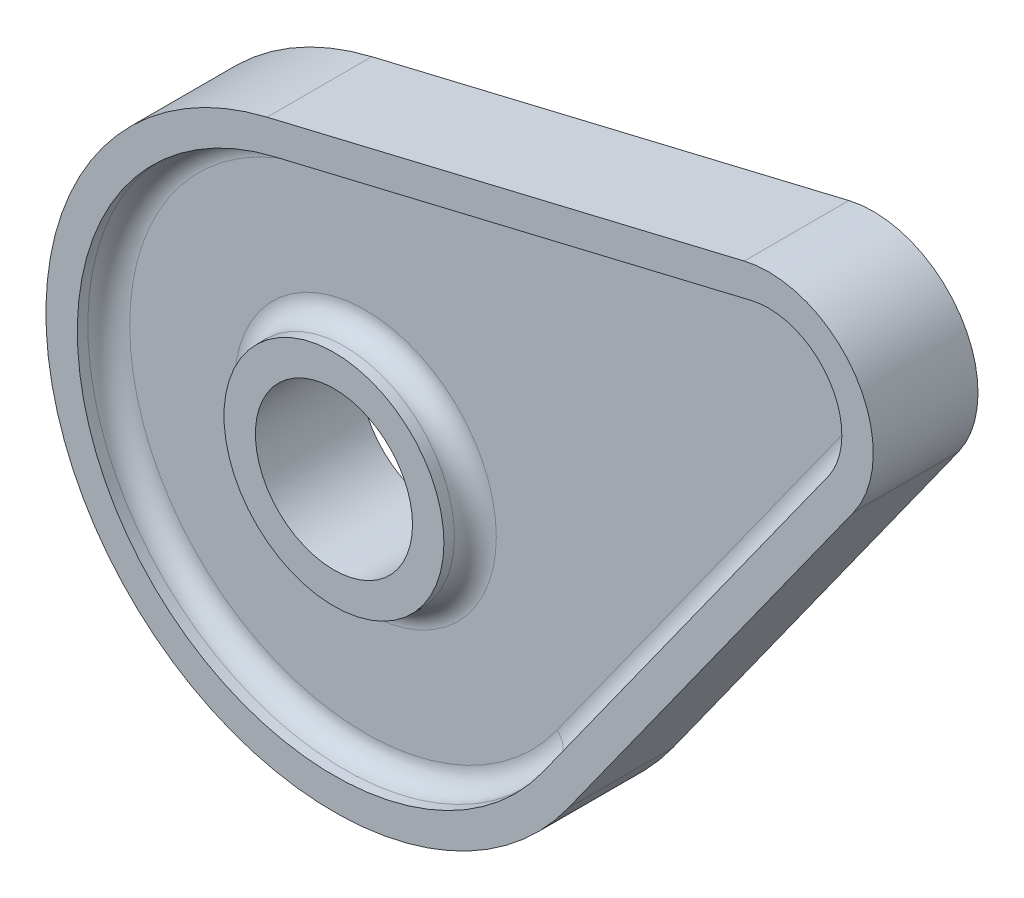
ISO-10303-21;
HEADER;
FILE_DESCRIPTION(('STEP AP214'),'2;1');
FILE_NAME('part.step','',(''),(''),'','','');
FILE_SCHEMA(('AUTOMOTIVE_DESIGN { 1 0 10303 214 1 1 1 1 }'));
ENDSEC;
DATA;
#1=APPLICATION_CONTEXT('core data for automotive mechanical design processes');
#2=APPLICATION_PROTOCOL_DEFINITION('international standard','automotive_design',2000,#1);
#3=PRODUCT_CONTEXT('',#1,'mechanical');
#4=PRODUCT('Part','Part','',(#3));
#5=PRODUCT_RELATED_PRODUCT_CATEGORY('part','',(#4));
#6=PRODUCT_DEFINITION_FORMATION('','',#4);
#7=PRODUCT_DEFINITION_CONTEXT('part definition',#1,'design');
#8=PRODUCT_DEFINITION('design','',#6,#7);
#9=PRODUCT_DEFINITION_SHAPE('','',#8);
#10=(LENGTH_UNIT() NAMED_UNIT(*) SI_UNIT(.MILLI.,.METRE.));
#11=(NAMED_UNIT(*) PLANE_ANGLE_UNIT() SI_UNIT($,.RADIAN.));
#12=(NAMED_UNIT(*) SI_UNIT($,.STERADIAN.) SOLID_ANGLE_UNIT());
#13=UNCERTAINTY_MEASURE_WITH_UNIT(LENGTH_MEASURE(1.E-05),#10,'distance_accuracy_value','');
#14=(GEOMETRIC_REPRESENTATION_CONTEXT(3) GLOBAL_UNCERTAINTY_ASSIGNED_CONTEXT((#13)) GLOBAL_UNIT_ASSIGNED_CONTEXT((#10,
#11,#12)) REPRESENTATION_CONTEXT('',''));
#15=CARTESIAN_POINT('',(0.,0.,0.));
#16=DIRECTION('',(0.,0.,1.));
#17=DIRECTION('',(1.,0.,0.));
#18=AXIS2_PLACEMENT_3D('',#15,#16,#17);
#19=CARTESIAN_POINT('',(-18.5097038965459,27.9026043452524,13.));
#20=DIRECTION('',(0.,0.,1.));
#21=DIRECTION('',(1.,0.,0.));
#22=AXIS2_PLACEMENT_3D('',#19,#20,#21);
#23=PLANE('',#22);
#24=CARTESIAN_POINT('',(-60.,0.,13.));
#25=DIRECTION('',(0.,0.,1.));
#26=DIRECTION('',(1.,0.,0.));
#27=AXIS2_PLACEMENT_3D('',#24,#25,#26);
#28=CIRCLE('',#27,7.5);
#29=CARTESIAN_POINT('',(-52.5,0.,13.));
#30=VERTEX_POINT('',#29);
#31=EDGE_CURVE('E214',#30,#30,#28,.T.);
#32=ORIENTED_EDGE('',*,*,#31,.T.);
#33=EDGE_LOOP('',(#32));
#34=FACE_BOUND('',#33,.T.);
#35=CARTESIAN_POINT('',(-60.0000000000032,0.,13.));
#36=DIRECTION('',(0.,0.,-1.));
#37=DIRECTION('',(-1.,0.,0.));
#38=AXIS2_PLACEMENT_3D('',#35,#36,#37);
#39=CIRCLE('',#38,10.4999999999969);
#40=CARTESIAN_POINT('',(-70.5000000000002,0.,13.));
#41=VERTEX_POINT('',#40);
#42=EDGE_CURVE('E307',#41,#41,#39,.T.);
#43=ORIENTED_EDGE('',*,*,#42,.T.);
#44=EDGE_LOOP('',(#43));
#45=FACE_BOUND('',#44,.T.);
#46=ADVANCED_FACE('F53',(#34,#45),#23,.F.);
#47=CARTESIAN_POINT('',(-18.5097038965459,27.9026043452524,23.));
#48=DIRECTION('',(0.,0.,1.));
#49=DIRECTION('',(1.,0.,0.));
#50=AXIS2_PLACEMENT_3D('',#47,#48,#49);
#51=PLANE('',#50);
#52=CARTESIAN_POINT('',(-60.,0.,23.));
#53=DIRECTION('',(0.,0.,1.));
#54=DIRECTION('',(1.,0.,0.));
#55=AXIS2_PLACEMENT_3D('',#52,#53,#54);
#56=CIRCLE('',#55,7.5);
#57=CARTESIAN_POINT('',(-52.5,0.,23.));
#58=VERTEX_POINT('',#57);
#59=EDGE_CURVE('E220',#58,#58,#56,.T.);
#60=ORIENTED_EDGE('',*,*,#59,.F.);
#61=EDGE_LOOP('',(#60));
#62=FACE_BOUND('',#61,.T.);
#63=CARTESIAN_POINT('',(-60.0000000000032,0.,23.));
#64=DIRECTION('',(0.,0.,1.));
#65=DIRECTION('',(1.,0.,0.));
#66=AXIS2_PLACEMENT_3D('',#63,#64,#65);
#67=CIRCLE('',#66,10.5000000000032);
#68=CARTESIAN_POINT('',(-49.5,0.,23.));
#69=VERTEX_POINT('',#68);
#70=EDGE_CURVE('E194',#69,#69,#67,.T.);
#71=ORIENTED_EDGE('',*,*,#70,.T.);
#72=EDGE_LOOP('',(#71));
#73=FACE_BOUND('',#72,.T.);
#74=ADVANCED_FACE('F358',(#62,#73),#51,.T.);
#75=DIRECTION('',(-0.972638678773851,-0.232323052134432,0.));
#76=VECTOR('',#75,1.);
#77=CARTESIAN_POINT('',(-8.93035481047707,37.3876308185639,23.));
#78=LINE('',#77,#76);
#79=CARTESIAN_POINT('',(-20.1359652614869,34.7110750966694,23.));
#80=VERTEX_POINT('',#79);
#81=CARTESIAN_POINT('',(-65.691914777294,23.8296476299609,23.));
#82=VERTEX_POINT('',#81);
#83=EDGE_CURVE('E199',#80,#82,#78,.T.);
#84=ORIENTED_EDGE('',*,*,#83,.F.);
#85=CARTESIAN_POINT('',(-18.5097038965459,27.9026043452524,23.));
#86=DIRECTION('',(0.,0.,1.));
#87=DIRECTION('',(1.,0.,0.));
#88=AXIS2_PLACEMENT_3D('',#85,#86,#87);
#89=CIRCLE('',#88,6.99999999999999);
#90=CARTESIAN_POINT('',(-12.8173935134663,23.8285888196702,23.));
#91=VERTEX_POINT('',#90);
#92=EDGE_CURVE('E208',#91,#80,#89,.T.);
#93=ORIENTED_EDGE('',*,*,#92,.F.);
#94=DIRECTION('',(0.582002217940317,0.81318719758279,0.));
#95=VECTOR('',#94,1.);
#96=CARTESIAN_POINT('',(-19.7533187579747,14.1375508160935,23.));
#97=LINE('',#96,#95);
#98=CARTESIAN_POINT('',(-40.0769136592217,-14.2590543395378,23.));
#99=VERTEX_POINT('',#98);
#100=EDGE_CURVE('E205',#99,#91,#97,.T.);
#101=ORIENTED_EDGE('',*,*,#100,.F.);
#102=CARTESIAN_POINT('',(-60.0000000000032,0.,23.));
#103=DIRECTION('',(0.,0.,1.));
#104=DIRECTION('',(1.,0.,0.));
#105=AXIS2_PLACEMENT_3D('',#102,#103,#104);
#106=CIRCLE('',#105,24.500000000001);
#107=EDGE_CURVE('E202',#82,#99,#106,.T.);
#108=ORIENTED_EDGE('',*,*,#107,.F.);
#109=EDGE_LOOP('',(#84,#93,#101,#108));
#110=FACE_BOUND('',#109,.T.);
#111=CARTESIAN_POINT('',(-18.5097038965459,27.9026043452524,23.));
#112=DIRECTION('',(0.,0.,1.));
#113=DIRECTION('',(1.,0.,0.));
#114=AXIS2_PLACEMENT_3D('',#111,#112,#113);
#115=CIRCLE('',#114,9.99999999999999);
#116=CARTESIAN_POINT('',(-10.377831920718,22.0825821658492,23.));
#117=VERTEX_POINT('',#116);
#118=CARTESIAN_POINT('',(-20.8329344178902,37.6289911329909,23.));
#119=VERTEX_POINT('',#118);
#120=EDGE_CURVE('E226',#117,#119,#115,.T.);
#121=ORIENTED_EDGE('',*,*,#120,.T.);
#122=DIRECTION('',(-0.972638678773851,-0.232323052134432,0.));
#123=VECTOR('',#122,1.);
#124=CARTESIAN_POINT('',(-20.8329344178902,37.6289911329909,23.));
#125=LINE('',#124,#123);
#126=CARTESIAN_POINT('',(-66.3888839336969,26.7475636662809,23.));
#127=VERTEX_POINT('',#126);
#128=EDGE_CURVE('E229',#119,#127,#125,.T.);
#129=ORIENTED_EDGE('',*,*,#128,.T.);
#130=CARTESIAN_POINT('',(-60.,0.,23.));
#131=DIRECTION('',(0.,0.,1.));
#132=DIRECTION('',(1.,0.,0.));
#133=AXIS2_PLACEMENT_3D('',#130,#131,#132);
#134=CIRCLE('',#133,27.5);
#135=CARTESIAN_POINT('',(-37.6373520664733,-16.0050609933587,23.));
#136=VERTEX_POINT('',#135);
#137=EDGE_CURVE('E232',#127,#136,#134,.T.);
#138=ORIENTED_EDGE('',*,*,#137,.T.);
#139=DIRECTION('',(0.582002217940317,0.81318719758279,0.));
#140=VECTOR('',#139,1.);
#141=CARTESIAN_POINT('',(-37.6373520664733,-16.0050609933587,23.));
#142=LINE('',#141,#140);
#143=EDGE_CURVE('E234',#136,#117,#142,.T.);
#144=ORIENTED_EDGE('',*,*,#143,.T.);
#145=EDGE_LOOP('',(#121,#129,#138,#144));
#146=FACE_BOUND('',#145,.T.);
#147=ADVANCED_FACE('F364',(#110,#146),#51,.T.);
#148=DIRECTION('',(-0.582002217940345,-0.81318719758277,0.));
#149=VECTOR('',#148,1.);
#150=CARTESIAN_POINT('',(-12.8173935134663,23.8285888196702,13.));
#151=LINE('',#150,#149);
#152=CARTESIAN_POINT('',(-12.8173935134663,23.8285888196702,13.));
#153=VERTEX_POINT('',#152);
#154=CARTESIAN_POINT('',(-40.0769136592236,-14.2590543395364,13.));
#155=VERTEX_POINT('',#154);
#156=EDGE_CURVE('E177',#153,#155,#151,.T.);
#157=ORIENTED_EDGE('',*,*,#156,.F.);
#158=CARTESIAN_POINT('',(-18.5097038965459,27.9026043452524,13.));
#159=DIRECTION('',(0.,0.,-1.));
#160=DIRECTION('',(-1.,0.,0.));
#161=AXIS2_PLACEMENT_3D('',#158,#159,#160);
#162=CIRCLE('',#161,7.);
#163=CARTESIAN_POINT('',(-20.1359652614869,34.7110750966694,13.));
#164=VERTEX_POINT('',#163);
#165=EDGE_CURVE('E182',#164,#153,#162,.T.);
#166=ORIENTED_EDGE('',*,*,#165,.F.);
#167=DIRECTION('',(0.972638678773851,0.232323052134432,0.));
#168=VECTOR('',#167,1.);
#169=CARTESIAN_POINT('',(-65.6919147772936,23.8296476299593,13.));
#170=LINE('',#169,#168);
#171=CARTESIAN_POINT('',(-65.6919147772936,23.8296476299593,13.));
#172=VERTEX_POINT('',#171);
#173=EDGE_CURVE('E187',#172,#164,#170,.T.);
#174=ORIENTED_EDGE('',*,*,#173,.F.);
#175=CARTESIAN_POINT('',(-60.0000000000032,0.,13.));
#176=DIRECTION('',(0.,0.,-1.));
#177=DIRECTION('',(-1.,0.,0.));
#178=AXIS2_PLACEMENT_3D('',#175,#176,#177);
#179=CIRCLE('',#178,24.5000000000002);
#180=EDGE_CURVE('E171',#155,#172,#179,.T.);
#181=ORIENTED_EDGE('',*,*,#180,.F.);
#182=EDGE_LOOP('',(#157,#166,#174,#181));
#183=FACE_BOUND('',#182,.T.);
#184=CARTESIAN_POINT('',(-18.5097038965459,27.9026043452524,13.));
#185=DIRECTION('',(0.,0.,1.));
#186=DIRECTION('',(1.,0.,0.));
#187=AXIS2_PLACEMENT_3D('',#184,#185,#186);
#188=CIRCLE('',#187,9.99999999999999);
#189=CARTESIAN_POINT('',(-10.377831920718,22.0825821658492,13.));
#190=VERTEX_POINT('',#189);
#191=CARTESIAN_POINT('',(-20.8329344178902,37.6289911329909,13.));
#192=VERTEX_POINT('',#191);
#193=EDGE_CURVE('E223',#190,#192,#188,.T.);
#194=ORIENTED_EDGE('',*,*,#193,.F.);
#195=DIRECTION('',(0.582002217940317,0.81318719758279,0.));
#196=VECTOR('',#195,1.);
#197=CARTESIAN_POINT('',(-37.6373520664733,-16.0050609933587,13.));
#198=LINE('',#197,#196);
#199=CARTESIAN_POINT('',(-37.6373520664733,-16.0050609933587,13.));
#200=VERTEX_POINT('',#199);
#201=EDGE_CURVE('E230',#200,#190,#198,.T.);
#202=ORIENTED_EDGE('',*,*,#201,.F.);
#203=CARTESIAN_POINT('',(-60.,0.,13.));
#204=DIRECTION('',(0.,0.,1.));
#205=DIRECTION('',(1.,0.,0.));
#206=AXIS2_PLACEMENT_3D('',#203,#204,#205);
#207=CIRCLE('',#206,27.5);
#208=CARTESIAN_POINT('',(-66.3888839336969,26.7475636662809,13.));
#209=VERTEX_POINT('',#208);
#210=EDGE_CURVE('E241',#209,#200,#207,.T.);
#211=ORIENTED_EDGE('',*,*,#210,.F.);
#212=DIRECTION('',(-0.972638678773851,-0.232323052134432,0.));
#213=VECTOR('',#212,1.);
#214=CARTESIAN_POINT('',(-20.8329344178902,37.6289911329909,13.));
#215=LINE('',#214,#213);
#216=EDGE_CURVE('E239',#192,#209,#215,.T.);
#217=ORIENTED_EDGE('',*,*,#216,.F.);
#218=EDGE_LOOP('',(#194,#202,#211,#217));
#219=FACE_BOUND('',#218,.T.);
#220=ADVANCED_FACE('F184',(#183,#219),#23,.F.);
#221=CARTESIAN_POINT('',(-18.5097038965459,27.9026043452524,23.));
#222=DIRECTION('',(0.,0.,-1.));
#223=DIRECTION('',(-1.,0.,0.));
#224=AXIS2_PLACEMENT_3D('',#221,#222,#223);
#225=CYLINDRICAL_SURFACE('',#224,9.99999999999999);
#226=ORIENTED_EDGE('',*,*,#193,.T.);
#227=DIRECTION('',(0.,0.,-1.));
#228=VECTOR('',#227,1.);
#229=CARTESIAN_POINT('',(-20.8329344178902,37.6289911329909,23.));
#230=LINE('',#229,#228);
#231=EDGE_CURVE('E252',#119,#192,#230,.T.);
#232=ORIENTED_EDGE('',*,*,#231,.F.);
#233=ORIENTED_EDGE('',*,*,#120,.F.);
#234=DIRECTION('',(0.,0.,-1.));
#235=VECTOR('',#234,1.);
#236=CARTESIAN_POINT('',(-10.377831920718,22.0825821658492,23.));
#237=LINE('',#236,#235);
#238=EDGE_CURVE('E236',#117,#190,#237,.T.);
#239=ORIENTED_EDGE('',*,*,#238,.T.);
#240=EDGE_LOOP('',(#226,#232,#233,#239));
#241=FACE_BOUND('',#240,.T.);
#242=ADVANCED_FACE('F369',(#241),#225,.T.);
#243=CARTESIAN_POINT('',(-20.8329344178902,37.6289911329909,23.));
#244=DIRECTION('',(0.232323052134432,-0.972638678773851,0.));
#245=DIRECTION('',(0.972638678773851,0.232323052134432,0.));
#246=AXIS2_PLACEMENT_3D('',#243,#244,#245);
#247=PLANE('',#246);
#248=ORIENTED_EDGE('',*,*,#216,.T.);
#249=DIRECTION('',(0.,0.,-1.));
#250=VECTOR('',#249,1.);
#251=CARTESIAN_POINT('',(-66.3888839336969,26.7475636662809,23.));
#252=LINE('',#251,#250);
#253=EDGE_CURVE('E249',#127,#209,#252,.T.);
#254=ORIENTED_EDGE('',*,*,#253,.F.);
#255=ORIENTED_EDGE('',*,*,#128,.F.);
#256=ORIENTED_EDGE('',*,*,#231,.T.);
#257=EDGE_LOOP('',(#248,#254,#255,#256));
#258=FACE_BOUND('',#257,.T.);
#259=ADVANCED_FACE('F374',(#258),#247,.F.);
#260=CARTESIAN_POINT('',(-60.,0.,23.));
#261=DIRECTION('',(0.,0.,-1.));
#262=DIRECTION('',(-1.,0.,0.));
#263=AXIS2_PLACEMENT_3D('',#260,#261,#262);
#264=CYLINDRICAL_SURFACE('',#263,27.5);
#265=ORIENTED_EDGE('',*,*,#210,.T.);
#266=DIRECTION('',(0.,0.,-1.));
#267=VECTOR('',#266,1.);
#268=CARTESIAN_POINT('',(-37.6373520664733,-16.0050609933587,23.));
#269=LINE('',#268,#267);
#270=EDGE_CURVE('E246',#136,#200,#269,.T.);
#271=ORIENTED_EDGE('',*,*,#270,.F.);
#272=ORIENTED_EDGE('',*,*,#137,.F.);
#273=ORIENTED_EDGE('',*,*,#253,.T.);
#274=EDGE_LOOP('',(#265,#271,#272,#273));
#275=FACE_BOUND('',#274,.T.);
#276=ADVANCED_FACE('F593',(#275),#264,.T.);
#277=CARTESIAN_POINT('',(-37.6373520664733,-16.0050609933587,23.));
#278=DIRECTION('',(-0.81318719758279,0.582002217940317,0.));
#279=DIRECTION('',(-0.582002217940317,-0.81318719758279,0.));
#280=AXIS2_PLACEMENT_3D('',#277,#278,#279);
#281=PLANE('',#280);
#282=ORIENTED_EDGE('',*,*,#201,.T.);
#283=ORIENTED_EDGE('',*,*,#238,.F.);
#284=ORIENTED_EDGE('',*,*,#143,.F.);
#285=ORIENTED_EDGE('',*,*,#270,.T.);
#286=EDGE_LOOP('',(#282,#283,#284,#285));
#287=FACE_BOUND('',#286,.T.);
#288=ADVANCED_FACE('F387',(#287),#281,.F.);
#289=CARTESIAN_POINT('',(-60.,0.,23.));
#290=DIRECTION('',(0.,0.,-1.));
#291=DIRECTION('',(-1.,0.,0.));
#292=AXIS2_PLACEMENT_3D('',#289,#290,#291);
#293=CYLINDRICAL_SURFACE('',#292,7.5);
#294=ORIENTED_EDGE('',*,*,#59,.T.);
#295=EDGE_LOOP('',(#294));
#296=FACE_BOUND('',#295,.T.);
#297=ORIENTED_EDGE('',*,*,#31,.F.);
#298=EDGE_LOOP('',(#297));
#299=FACE_BOUND('',#298,.T.);
#300=ADVANCED_FACE('F383',(#296,#299),#293,.F.);
#301=CARTESIAN_POINT('',(-8.93035481047707,37.3876308185639,20.));
#302=DIRECTION('',(-0.232323052134432,0.972638678773851,0.));
#303=DIRECTION('',(-0.972638678773851,-0.232323052134432,0.));
#304=AXIS2_PLACEMENT_3D('',#301,#302,#303);
#305=PLANE('',#304);
#306=DIRECTION('',(0.,0.,1.));
#307=VECTOR('',#306,1.);
#308=CARTESIAN_POINT('',(-65.6919147772936,23.8296476299593,20.));
#309=LINE('',#308,#307);
#310=CARTESIAN_POINT('',(-65.6919147772936,23.8296476299593,22.));
#311=VERTEX_POINT('',#310);
#312=EDGE_CURVE('E211',#311,#82,#309,.T.);
#313=ORIENTED_EDGE('',*,*,#312,.F.);
#314=DIRECTION('',(-0.972638678773851,-0.232323052134432,0.));
#315=VECTOR('',#314,1.);
#316=CARTESIAN_POINT('',(-8.93035481047707,37.3876308185639,22.));
#317=LINE('',#316,#315);
#318=CARTESIAN_POINT('',(-20.1359652614869,34.7110750966694,22.));
#319=VERTEX_POINT('',#318);
#320=EDGE_CURVE('E274',#311,#319,#317,.F.);
#321=ORIENTED_EDGE('',*,*,#320,.T.);
#322=DIRECTION('',(0.,0.,1.));
#323=VECTOR('',#322,1.);
#324=CARTESIAN_POINT('',(-20.1359652614869,34.7110750966694,20.));
#325=LINE('',#324,#323);
#326=EDGE_CURVE('E212',#319,#80,#325,.T.);
#327=ORIENTED_EDGE('',*,*,#326,.T.);
#328=ORIENTED_EDGE('',*,*,#83,.T.);
#329=EDGE_LOOP('',(#313,#321,#327,#328));
#330=FACE_BOUND('',#329,.T.);
#331=ADVANCED_FACE('F386',(#330),#305,.F.);
#332=CARTESIAN_POINT('',(-18.5097038965459,27.9026043452524,20.));
#333=DIRECTION('',(0.,0.,1.));
#334=DIRECTION('',(1.,0.,0.));
#335=AXIS2_PLACEMENT_3D('',#332,#333,#334);
#336=CYLINDRICAL_SURFACE('',#335,6.99999999999999);
#337=ORIENTED_EDGE('',*,*,#326,.F.);
#338=CARTESIAN_POINT('',(-18.5097038965459,27.9026043452524,22.));
#339=DIRECTION('',(0.,0.,1.));
#340=DIRECTION('',(1.,0.,0.));
#341=AXIS2_PLACEMENT_3D('',#338,#339,#340);
#342=CIRCLE('',#341,6.99999999999999);
#343=CARTESIAN_POINT('',(-12.8173935134663,23.8285888196702,22.));
#344=VERTEX_POINT('',#343);
#345=EDGE_CURVE('E267',#319,#344,#342,.F.);
#346=ORIENTED_EDGE('',*,*,#345,.T.);
#347=DIRECTION('',(0.,0.,1.));
#348=VECTOR('',#347,1.);
#349=CARTESIAN_POINT('',(-12.8173935134663,23.8285888196702,20.));
#350=LINE('',#349,#348);
#351=EDGE_CURVE('E215',#344,#91,#350,.T.);
#352=ORIENTED_EDGE('',*,*,#351,.T.);
#353=ORIENTED_EDGE('',*,*,#92,.T.);
#354=EDGE_LOOP('',(#337,#346,#352,#353));
#355=FACE_BOUND('',#354,.T.);
#356=ADVANCED_FACE('F397',(#355),#336,.F.);
#357=CARTESIAN_POINT('',(-19.7533187579747,14.1375508160935,20.));
#358=DIRECTION('',(0.81318719758279,-0.582002217940317,0.));
#359=DIRECTION('',(0.582002217940317,0.81318719758279,0.));
#360=AXIS2_PLACEMENT_3D('',#357,#358,#359);
#361=PLANE('',#360);
#362=ORIENTED_EDGE('',*,*,#351,.F.);
#363=DIRECTION('',(0.582002217940317,0.81318719758279,0.));
#364=VECTOR('',#363,1.);
#365=CARTESIAN_POINT('',(-19.7533187579747,14.1375508160935,22.));
#366=LINE('',#365,#364);
#367=CARTESIAN_POINT('',(-40.0769136592217,-14.2590543395378,22.));
#368=VERTEX_POINT('',#367);
#369=EDGE_CURVE('E270',#344,#368,#366,.F.);
#370=ORIENTED_EDGE('',*,*,#369,.T.);
#371=DIRECTION('',(0.,0.,1.));
#372=VECTOR('',#371,1.);
#373=CARTESIAN_POINT('',(-40.0769136592217,-14.2590543395378,20.));
#374=LINE('',#373,#372);
#375=EDGE_CURVE('E217',#368,#99,#374,.T.);
#376=ORIENTED_EDGE('',*,*,#375,.T.);
#377=ORIENTED_EDGE('',*,*,#100,.T.);
#378=EDGE_LOOP('',(#362,#370,#376,#377));
#379=FACE_BOUND('',#378,.T.);
#380=ADVANCED_FACE('F393',(#379),#361,.F.);
#381=CARTESIAN_POINT('',(-60.0000000000032,0.,20.));
#382=DIRECTION('',(0.,0.,1.));
#383=DIRECTION('',(1.,0.,0.));
#384=AXIS2_PLACEMENT_3D('',#381,#382,#383);
#385=CYLINDRICAL_SURFACE('',#384,10.5000000000032);
#386=CARTESIAN_POINT('',(-60.0000000000032,0.,22.));
#387=DIRECTION('',(0.,0.,1.));
#388=DIRECTION('',(1.,0.,0.));
#389=AXIS2_PLACEMENT_3D('',#386,#387,#388);
#390=CIRCLE('',#389,10.5000000000032);
#391=CARTESIAN_POINT('',(-49.5,0.,22.));
#392=VERTEX_POINT('',#391);
#393=EDGE_CURVE('E276',#392,#392,#390,.T.);
#394=ORIENTED_EDGE('',*,*,#393,.T.);
#395=EDGE_LOOP('',(#394));
#396=FACE_BOUND('',#395,.T.);
#397=ORIENTED_EDGE('',*,*,#70,.F.);
#398=EDGE_LOOP('',(#397));
#399=FACE_BOUND('',#398,.T.);
#400=ADVANCED_FACE('F389',(#396,#399),#385,.T.);
#401=CARTESIAN_POINT('',(-60.0000000000032,0.,20.));
#402=DIRECTION('',(0.,0.,1.));
#403=DIRECTION('',(1.,0.,0.));
#404=AXIS2_PLACEMENT_3D('',#401,#402,#403);
#405=CYLINDRICAL_SURFACE('',#404,24.500000000001);
#406=ORIENTED_EDGE('',*,*,#375,.F.);
#407=CARTESIAN_POINT('',(-60.0000000000032,0.,22.));
#408=DIRECTION('',(0.,0.,1.));
#409=DIRECTION('',(1.,0.,0.));
#410=AXIS2_PLACEMENT_3D('',#407,#408,#409);
#411=CIRCLE('',#410,24.500000000001);
#412=EDGE_CURVE('E272',#368,#311,#411,.F.);
#413=ORIENTED_EDGE('',*,*,#412,.T.);
#414=ORIENTED_EDGE('',*,*,#312,.T.);
#415=ORIENTED_EDGE('',*,*,#107,.T.);
#416=EDGE_LOOP('',(#406,#413,#414,#415));
#417=FACE_BOUND('',#416,.T.);
#418=ADVANCED_FACE('F392',(#417),#405,.F.);
#419=CARTESIAN_POINT('',(0.,0.,20.));
#420=DIRECTION('',(0.,0.,1.));
#421=DIRECTION('',(1.,0.,0.));
#422=AXIS2_PLACEMENT_3D('',#419,#420,#421);
#423=PLANE('',#422);
#424=DIRECTION('',(0.582002217940317,0.81318719758279,0.));
#425=VECTOR('',#424,1.);
#426=CARTESIAN_POINT('',(-21.3796931531403,15.3015552519741,20.));
#427=LINE('',#426,#425);
#428=CARTESIAN_POINT('',(-41.7032880543886,-13.0950499036562,20.));
#429=VERTEX_POINT('',#428);
#430=CARTESIAN_POINT('',(-14.4437679086319,24.9925932555508,20.));
#431=VERTEX_POINT('',#430);
#432=EDGE_CURVE('E262',#429,#431,#427,.T.);
#433=ORIENTED_EDGE('',*,*,#432,.T.);
#434=CARTESIAN_POINT('',(-18.5097038965459,27.9026043452524,20.));
#435=DIRECTION('',(0.,0.,1.));
#436=DIRECTION('',(1.,0.,0.));
#437=AXIS2_PLACEMENT_3D('',#434,#435,#436);
#438=CIRCLE('',#437,4.99999999999999);
#439=CARTESIAN_POINT('',(-19.671319157218,32.7657977391217,20.));
#440=VERTEX_POINT('',#439);
#441=EDGE_CURVE('E264',#431,#440,#438,.T.);
#442=ORIENTED_EDGE('',*,*,#441,.T.);
#443=DIRECTION('',(-0.972638678773851,-0.232323052134432,0.));
#444=VECTOR('',#443,1.);
#445=CARTESIAN_POINT('',(-8.46570870620821,35.4423534610162,20.));
#446=LINE('',#445,#444);
#447=CARTESIAN_POINT('',(-65.227268673025,21.8843702724116,20.));
#448=VERTEX_POINT('',#447);
#449=EDGE_CURVE('E258',#440,#448,#446,.T.);
#450=ORIENTED_EDGE('',*,*,#449,.T.);
#451=CARTESIAN_POINT('',(-60.0000000000032,0.,20.));
#452=DIRECTION('',(0.,0.,1.));
#453=DIRECTION('',(1.,0.,0.));
#454=AXIS2_PLACEMENT_3D('',#451,#452,#453);
#455=CIRCLE('',#454,22.500000000001);
#456=EDGE_CURVE('E260',#448,#429,#455,.T.);
#457=ORIENTED_EDGE('',*,*,#456,.T.);
#458=EDGE_LOOP('',(#433,#442,#450,#457));
#459=FACE_BOUND('',#458,.T.);
#460=CARTESIAN_POINT('',(-60.0000000000032,0.,20.));
#461=DIRECTION('',(0.,0.,1.));
#462=DIRECTION('',(1.,0.,0.));
#463=AXIS2_PLACEMENT_3D('',#460,#461,#462);
#464=CIRCLE('',#463,12.5000000000032);
#465=CARTESIAN_POINT('',(-47.5,0.,20.));
#466=VERTEX_POINT('',#465);
#467=EDGE_CURVE('E255',#466,#466,#464,.F.);
#468=ORIENTED_EDGE('',*,*,#467,.T.);
#469=EDGE_LOOP('',(#468));
#470=FACE_BOUND('',#469,.T.);
#471=ADVANCED_FACE('F401',(#459,#470),#423,.T.);
#472=CARTESIAN_POINT('',(-18.5097038965459,27.9026043452524,16.));
#473=DIRECTION('',(0.,0.,-1.));
#474=DIRECTION('',(-1.,0.,0.));
#475=AXIS2_PLACEMENT_3D('',#472,#473,#474);
#476=CYLINDRICAL_SURFACE('',#475,7.);
#477=DIRECTION('',(0.,0.,-1.));
#478=VECTOR('',#477,1.);
#479=CARTESIAN_POINT('',(-12.8173935134663,23.8285888196702,16.));
#480=LINE('',#479,#478);
#481=CARTESIAN_POINT('',(-12.8173935134663,23.8285888196702,14.));
#482=VERTEX_POINT('',#481);
#483=EDGE_CURVE('E174',#482,#153,#480,.T.);
#484=ORIENTED_EDGE('',*,*,#483,.F.);
#485=CARTESIAN_POINT('',(-18.5097038965459,27.9026043452524,14.));
#486=DIRECTION('',(0.,0.,-1.));
#487=DIRECTION('',(-1.,0.,0.));
#488=AXIS2_PLACEMENT_3D('',#485,#486,#487);
#489=CIRCLE('',#488,7.);
#490=CARTESIAN_POINT('',(-20.1359652614869,34.7110750966694,14.));
#491=VERTEX_POINT('',#490);
#492=EDGE_CURVE('E62',#482,#491,#489,.F.);
#493=ORIENTED_EDGE('',*,*,#492,.T.);
#494=DIRECTION('',(0.,0.,-1.));
#495=VECTOR('',#494,1.);
#496=CARTESIAN_POINT('',(-20.1359652614869,34.7110750966694,16.));
#497=LINE('',#496,#495);
#498=EDGE_CURVE('E192',#491,#164,#497,.T.);
#499=ORIENTED_EDGE('',*,*,#498,.T.);
#500=ORIENTED_EDGE('',*,*,#165,.T.);
#501=EDGE_LOOP('',(#484,#493,#499,#500));
#502=FACE_BOUND('',#501,.T.);
#503=ADVANCED_FACE('F330',(#502),#476,.F.);
#504=CARTESIAN_POINT('',(-65.6919147772936,23.8296476299593,16.));
#505=DIRECTION('',(-0.232323052134432,0.972638678773851,0.));
#506=DIRECTION('',(-0.972638678773851,-0.232323052134432,0.));
#507=AXIS2_PLACEMENT_3D('',#504,#505,#506);
#508=PLANE('',#507);
#509=ORIENTED_EDGE('',*,*,#498,.F.);
#510=DIRECTION('',(0.972638678773851,0.232323052134432,0.));
#511=VECTOR('',#510,1.);
#512=CARTESIAN_POINT('',(-65.6919147772936,23.8296476299593,14.));
#513=LINE('',#512,#511);
#514=CARTESIAN_POINT('',(-65.6919147772936,23.8296476299593,14.));
#515=VERTEX_POINT('',#514);
#516=EDGE_CURVE('E291',#491,#515,#513,.F.);
#517=ORIENTED_EDGE('',*,*,#516,.T.);
#518=DIRECTION('',(0.,0.,-1.));
#519=VECTOR('',#518,1.);
#520=CARTESIAN_POINT('',(-65.6919147772936,23.8296476299593,16.));
#521=LINE('',#520,#519);
#522=EDGE_CURVE('E173',#515,#172,#521,.T.);
#523=ORIENTED_EDGE('',*,*,#522,.T.);
#524=ORIENTED_EDGE('',*,*,#173,.T.);
#525=EDGE_LOOP('',(#509,#517,#523,#524));
#526=FACE_BOUND('',#525,.T.);
#527=ADVANCED_FACE('F333',(#526),#508,.F.);
#528=CARTESIAN_POINT('',(-60.0000000000032,0.,16.));
#529=DIRECTION('',(0.,0.,-1.));
#530=DIRECTION('',(-1.,0.,0.));
#531=AXIS2_PLACEMENT_3D('',#528,#529,#530);
#532=CYLINDRICAL_SURFACE('',#531,24.5000000000002);
#533=ORIENTED_EDGE('',*,*,#522,.F.);
#534=CARTESIAN_POINT('',(-60.0000000000032,0.,14.));
#535=DIRECTION('',(0.,0.,-1.));
#536=DIRECTION('',(-1.,0.,0.));
#537=AXIS2_PLACEMENT_3D('',#534,#535,#536);
#538=CIRCLE('',#537,24.5000000000002);
#539=CARTESIAN_POINT('',(-40.0769136592236,-14.2590543395364,14.));
#540=VERTEX_POINT('',#539);
#541=EDGE_CURVE('E78',#515,#540,#538,.F.);
#542=ORIENTED_EDGE('',*,*,#541,.T.);
#543=DIRECTION('',(0.,0.,-1.));
#544=VECTOR('',#543,1.);
#545=CARTESIAN_POINT('',(-40.0769136592236,-14.2590543395364,16.));
#546=LINE('',#545,#544);
#547=EDGE_CURVE('E167',#540,#155,#546,.T.);
#548=ORIENTED_EDGE('',*,*,#547,.T.);
#549=ORIENTED_EDGE('',*,*,#180,.T.);
#550=EDGE_LOOP('',(#533,#542,#548,#549));
#551=FACE_BOUND('',#550,.T.);
#552=ADVANCED_FACE('F169',(#551),#532,.F.);
#553=CARTESIAN_POINT('',(-12.8173935134663,23.8285888196702,16.));
#554=DIRECTION('',(0.81318719758277,-0.582002217940345,0.));
#555=DIRECTION('',(0.582002217940345,0.81318719758277,0.));
#556=AXIS2_PLACEMENT_3D('',#553,#554,#555);
#557=PLANE('',#556);
#558=ORIENTED_EDGE('',*,*,#547,.F.);
#559=DIRECTION('',(-0.582002217940345,-0.81318719758277,0.));
#560=VECTOR('',#559,1.);
#561=CARTESIAN_POINT('',(-12.8173935134663,23.8285888196702,14.));
#562=LINE('',#561,#560);
#563=EDGE_CURVE('E70',#540,#482,#562,.F.);
#564=ORIENTED_EDGE('',*,*,#563,.T.);
#565=ORIENTED_EDGE('',*,*,#483,.T.);
#566=ORIENTED_EDGE('',*,*,#156,.T.);
#567=EDGE_LOOP('',(#558,#564,#565,#566));
#568=FACE_BOUND('',#567,.T.);
#569=ADVANCED_FACE('F178',(#568),#557,.F.);
#570=CARTESIAN_POINT('',(-18.5097038965459,27.9026043452524,16.));
#571=DIRECTION('',(0.,0.,-1.));
#572=DIRECTION('',(-1.,0.,0.));
#573=AXIS2_PLACEMENT_3D('',#570,#571,#572);
#574=PLANE('',#573);
#575=CARTESIAN_POINT('',(-60.0000000000032,0.,16.));
#576=DIRECTION('',(0.,0.,-1.));
#577=DIRECTION('',(-1.,0.,0.));
#578=AXIS2_PLACEMENT_3D('',#575,#576,#577);
#579=CIRCLE('',#578,22.5000000000002);
#580=CARTESIAN_POINT('',(-41.7032880543886,-13.0950499036563,16.));
#581=VERTEX_POINT('',#580);
#582=CARTESIAN_POINT('',(-65.2272686730249,21.8843702724124,16.));
#583=VERTEX_POINT('',#582);
#584=EDGE_CURVE('E286',#581,#583,#579,.T.);
#585=ORIENTED_EDGE('',*,*,#584,.T.);
#586=DIRECTION('',(0.972638678773851,0.232323052134432,0.));
#587=VECTOR('',#586,1.);
#588=CARTESIAN_POINT('',(-19.671319157218,32.7657977391217,16.));
#589=LINE('',#588,#587);
#590=CARTESIAN_POINT('',(-19.671319157218,32.7657977391217,16.));
#591=VERTEX_POINT('',#590);
#592=EDGE_CURVE('E288',#583,#591,#589,.T.);
#593=ORIENTED_EDGE('',*,*,#592,.T.);
#594=CARTESIAN_POINT('',(-18.5097038965459,27.9026043452524,16.));
#595=DIRECTION('',(0.,0.,-1.));
#596=DIRECTION('',(-1.,0.,0.));
#597=AXIS2_PLACEMENT_3D('',#594,#595,#596);
#598=CIRCLE('',#597,5.);
#599=CARTESIAN_POINT('',(-14.4437679086319,24.9925932555509,16.));
#600=VERTEX_POINT('',#599);
#601=EDGE_CURVE('E282',#591,#600,#598,.T.);
#602=ORIENTED_EDGE('',*,*,#601,.T.);
#603=DIRECTION('',(-0.582002217940345,-0.81318719758277,0.));
#604=VECTOR('',#603,1.);
#605=CARTESIAN_POINT('',(-14.443767908632,24.9925932555507,16.));
#606=LINE('',#605,#604);
#607=EDGE_CURVE('E284',#600,#581,#606,.T.);
#608=ORIENTED_EDGE('',*,*,#607,.T.);
#609=EDGE_LOOP('',(#585,#593,#602,#608));
#610=FACE_BOUND('',#609,.T.);
#611=CARTESIAN_POINT('',(-60.0000000000032,0.,16.));
#612=DIRECTION('',(0.,0.,-1.));
#613=DIRECTION('',(-1.,0.,0.));
#614=AXIS2_PLACEMENT_3D('',#611,#612,#613);
#615=CIRCLE('',#614,12.4999999999969);
#616=CARTESIAN_POINT('',(-72.5000000000002,0.,16.));
#617=VERTEX_POINT('',#616);
#618=EDGE_CURVE('E279',#617,#617,#615,.F.);
#619=ORIENTED_EDGE('',*,*,#618,.T.);
#620=EDGE_LOOP('',(#619));
#621=FACE_BOUND('',#620,.T.);
#622=ADVANCED_FACE('F338',(#610,#621),#574,.T.);
#623=CARTESIAN_POINT('',(-60.0000000000032,0.,16.));
#624=DIRECTION('',(0.,0.,-1.));
#625=DIRECTION('',(-1.,0.,0.));
#626=AXIS2_PLACEMENT_3D('',#623,#624,#625);
#627=CYLINDRICAL_SURFACE('',#626,10.4999999999969);
#628=CARTESIAN_POINT('',(-60.0000000000032,0.,14.));
#629=DIRECTION('',(0.,0.,-1.));
#630=DIRECTION('',(-1.,0.,0.));
#631=AXIS2_PLACEMENT_3D('',#628,#629,#630);
#632=CIRCLE('',#631,10.4999999999969);
#633=CARTESIAN_POINT('',(-70.5000000000002,0.,14.));
#634=VERTEX_POINT('',#633);
#635=EDGE_CURVE('E13',#634,#634,#632,.T.);
#636=ORIENTED_EDGE('',*,*,#635,.T.);
#637=EDGE_LOOP('',(#636));
#638=FACE_BOUND('',#637,.T.);
#639=ORIENTED_EDGE('',*,*,#42,.F.);
#640=EDGE_LOOP('',(#639));
#641=FACE_BOUND('',#640,.T.);
#642=ADVANCED_FACE('F341',(#638,#641),#627,.T.);
#643=CARTESIAN_POINT('',(-60.0000000000032,0.,22.));
#644=DIRECTION('',(0.,0.,1.));
#645=DIRECTION('',(1.,0.,0.));
#646=AXIS2_PLACEMENT_3D('',#643,#644,#645);
#647=TOROIDAL_SURFACE('',#646,22.500000000001,2.);
#648=CARTESIAN_POINT('',(-65.2272686730253,21.8843702724132,22.));
#649=DIRECTION('',(-0.972638678773881,-0.232323052134304,0.));
#650=DIRECTION('',(0.232323052134304,-0.972638678773881,0.));
#651=AXIS2_PLACEMENT_3D('',#648,#649,#650);
#652=CIRCLE('',#651,2.);
#653=EDGE_CURVE('E301',#311,#448,#652,.T.);
#654=ORIENTED_EDGE('',*,*,#653,.F.);
#655=ORIENTED_EDGE('',*,*,#412,.F.);
#656=CARTESIAN_POINT('',(-41.7032880543886,-13.0950499036562,22.));
#657=DIRECTION('',(-0.582002217940318,-0.81318719758279,0.));
#658=DIRECTION('',(0.81318719758279,-0.582002217940318,0.));
#659=AXIS2_PLACEMENT_3D('',#656,#657,#658);
#660=CIRCLE('',#659,2.);
#661=EDGE_CURVE('E304',#429,#368,#660,.T.);
#662=ORIENTED_EDGE('',*,*,#661,.F.);
#663=ORIENTED_EDGE('',*,*,#456,.F.);
#664=EDGE_LOOP('',(#654,#655,#662,#663));
#665=FACE_BOUND('',#664,.T.);
#666=ADVANCED_FACE('F351',(#665),#647,.F.);
#667=CARTESIAN_POINT('',(-21.3796931531403,15.3015552519741,22.));
#668=DIRECTION('',(0.582002217940317,0.81318719758279,0.));
#669=DIRECTION('',(-0.81318719758279,0.582002217940317,0.));
#670=AXIS2_PLACEMENT_3D('',#667,#668,#669);
#671=CYLINDRICAL_SURFACE('',#670,2.);
#672=ORIENTED_EDGE('',*,*,#661,.T.);
#673=ORIENTED_EDGE('',*,*,#369,.F.);
#674=CARTESIAN_POINT('',(-14.4437679086319,24.9925932555508,22.));
#675=DIRECTION('',(-0.582002217940319,-0.813187197582789,0.));
#676=DIRECTION('',(0.813187197582789,-0.582002217940319,0.));
#677=AXIS2_PLACEMENT_3D('',#674,#675,#676);
#678=CIRCLE('',#677,2.);
#679=EDGE_CURVE('E299',#431,#344,#678,.T.);
#680=ORIENTED_EDGE('',*,*,#679,.F.);
#681=ORIENTED_EDGE('',*,*,#432,.F.);
#682=EDGE_LOOP('',(#672,#673,#680,#681));
#683=FACE_BOUND('',#682,.T.);
#684=ADVANCED_FACE('F445',(#683),#671,.F.);
#685=CARTESIAN_POINT('',(-8.46570870620821,35.4423534610162,22.));
#686=DIRECTION('',(-0.972638678773851,-0.232323052134432,0.));
#687=DIRECTION('',(0.232323052134432,-0.972638678773851,0.));
#688=AXIS2_PLACEMENT_3D('',#685,#686,#687);
#689=CYLINDRICAL_SURFACE('',#688,2.);
#690=ORIENTED_EDGE('',*,*,#653,.T.);
#691=ORIENTED_EDGE('',*,*,#449,.F.);
#692=CARTESIAN_POINT('',(-19.671319157218,32.7657977391217,22.));
#693=DIRECTION('',(-0.972638678773851,-0.232323052134432,0.));
#694=DIRECTION('',(0.232323052134432,-0.972638678773851,0.));
#695=AXIS2_PLACEMENT_3D('',#692,#693,#694);
#696=CIRCLE('',#695,2.);
#697=EDGE_CURVE('E297',#319,#440,#696,.T.);
#698=ORIENTED_EDGE('',*,*,#697,.F.);
#699=ORIENTED_EDGE('',*,*,#320,.F.);
#700=EDGE_LOOP('',(#690,#691,#698,#699));
#701=FACE_BOUND('',#700,.T.);
#702=ADVANCED_FACE('F453',(#701),#689,.F.);
#703=CARTESIAN_POINT('',(-18.5097038965459,27.9026043452524,22.));
#704=DIRECTION('',(0.,0.,1.));
#705=DIRECTION('',(1.,0.,0.));
#706=AXIS2_PLACEMENT_3D('',#703,#704,#705);
#707=TOROIDAL_SURFACE('',#706,4.99999999999999,2.);
#708=ORIENTED_EDGE('',*,*,#679,.T.);
#709=ORIENTED_EDGE('',*,*,#345,.F.);
#710=ORIENTED_EDGE('',*,*,#697,.T.);
#711=ORIENTED_EDGE('',*,*,#441,.F.);
#712=EDGE_LOOP('',(#708,#709,#710,#711));
#713=FACE_BOUND('',#712,.T.);
#714=ADVANCED_FACE('F461',(#713),#707,.F.);
#715=CARTESIAN_POINT('',(-60.0000000000032,0.,22.));
#716=DIRECTION('',(0.,0.,1.));
#717=DIRECTION('',(1.,0.,0.));
#718=AXIS2_PLACEMENT_3D('',#715,#716,#717);
#719=TOROIDAL_SURFACE('',#718,12.5000000000032,2.);
#720=ORIENTED_EDGE('',*,*,#467,.F.);
#721=EDGE_LOOP('',(#720));
#722=FACE_BOUND('',#721,.T.);
#723=ORIENTED_EDGE('',*,*,#393,.F.);
#724=EDGE_LOOP('',(#723));
#725=FACE_BOUND('',#724,.T.);
#726=ADVANCED_FACE('F469',(#722,#725),#719,.F.);
#727=CARTESIAN_POINT('',(-14.443767908632,24.9925932555507,14.));
#728=DIRECTION('',(-0.582002217940345,-0.81318719758277,0.));
#729=DIRECTION('',(0.81318719758277,-0.582002217940345,0.));
#730=AXIS2_PLACEMENT_3D('',#727,#728,#729);
#731=CYLINDRICAL_SURFACE('',#730,2.);
#732=CARTESIAN_POINT('',(-14.4437679086319,24.9925932555509,14.));
#733=DIRECTION('',(-0.582002217940345,-0.81318719758277,0.));
#734=DIRECTION('',(0.81318719758277,-0.582002217940345,0.));
#735=AXIS2_PLACEMENT_3D('',#732,#733,#734);
#736=CIRCLE('',#735,2.);
#737=EDGE_CURVE('E311',#482,#600,#736,.T.);
#738=ORIENTED_EDGE('',*,*,#737,.F.);
#739=ORIENTED_EDGE('',*,*,#563,.F.);
#740=CARTESIAN_POINT('',(-41.7032880543886,-13.0950499036563,14.));
#741=DIRECTION('',(0.582002217940254,0.813187197582836,0.));
#742=DIRECTION('',(-0.813187197582836,0.582002217940254,0.));
#743=AXIS2_PLACEMENT_3D('',#740,#741,#742);
#744=CIRCLE('',#743,2.);
#745=EDGE_CURVE('E57',#581,#540,#744,.T.);
#746=ORIENTED_EDGE('',*,*,#745,.F.);
#747=ORIENTED_EDGE('',*,*,#607,.F.);
#748=EDGE_LOOP('',(#738,#739,#746,#747));
#749=FACE_BOUND('',#748,.T.);
#750=ADVANCED_FACE('F325',(#749),#731,.F.);
#751=CARTESIAN_POINT('',(-60.0000000000032,0.,14.));
#752=DIRECTION('',(0.,0.,-1.));
#753=DIRECTION('',(-1.,0.,0.));
#754=AXIS2_PLACEMENT_3D('',#751,#752,#753);
#755=TOROIDAL_SURFACE('',#754,22.5000000000002,2.);
#756=ORIENTED_EDGE('',*,*,#745,.T.);
#757=ORIENTED_EDGE('',*,*,#541,.F.);
#758=CARTESIAN_POINT('',(-65.2272686730249,21.8843702724124,14.));
#759=DIRECTION('',(-0.97263867877385,-0.232323052134435,0.));
#760=DIRECTION('',(0.232323052134435,-0.97263867877385,0.));
#761=AXIS2_PLACEMENT_3D('',#758,#759,#760);
#762=CIRCLE('',#761,2.);
#763=EDGE_CURVE('E310',#583,#515,#762,.T.);
#764=ORIENTED_EDGE('',*,*,#763,.F.);
#765=ORIENTED_EDGE('',*,*,#584,.F.);
#766=EDGE_LOOP('',(#756,#757,#764,#765));
#767=FACE_BOUND('',#766,.T.);
#768=ADVANCED_FACE('F321',(#767),#755,.F.);
#769=CARTESIAN_POINT('',(-18.5097038965459,27.9026043452524,14.));
#770=DIRECTION('',(0.,0.,-1.));
#771=DIRECTION('',(-1.,0.,0.));
#772=AXIS2_PLACEMENT_3D('',#769,#770,#771);
#773=TOROIDAL_SURFACE('',#772,5.,2.);
#774=ORIENTED_EDGE('',*,*,#737,.T.);
#775=ORIENTED_EDGE('',*,*,#601,.F.);
#776=CARTESIAN_POINT('',(-19.671319157218,32.7657977391217,14.));
#777=DIRECTION('',(0.972638678773851,0.232323052134432,0.));
#778=DIRECTION('',(-0.232323052134432,0.972638678773851,0.));
#779=AXIS2_PLACEMENT_3D('',#776,#777,#778);
#780=CIRCLE('',#779,2.);
#781=EDGE_CURVE('E308',#491,#591,#780,.T.);
#782=ORIENTED_EDGE('',*,*,#781,.F.);
#783=ORIENTED_EDGE('',*,*,#492,.F.);
#784=EDGE_LOOP('',(#774,#775,#782,#783));
#785=FACE_BOUND('',#784,.T.);
#786=ADVANCED_FACE('F327',(#785),#773,.F.);
#787=CARTESIAN_POINT('',(-19.671319157218,32.7657977391217,14.));
#788=DIRECTION('',(0.972638678773851,0.232323052134432,0.));
#789=DIRECTION('',(-0.232323052134432,0.972638678773851,0.));
#790=AXIS2_PLACEMENT_3D('',#787,#788,#789);
#791=CYLINDRICAL_SURFACE('',#790,2.);
#792=ORIENTED_EDGE('',*,*,#763,.T.);
#793=ORIENTED_EDGE('',*,*,#516,.F.);
#794=ORIENTED_EDGE('',*,*,#781,.T.);
#795=ORIENTED_EDGE('',*,*,#592,.F.);
#796=EDGE_LOOP('',(#792,#793,#794,#795));
#797=FACE_BOUND('',#796,.T.);
#798=ADVANCED_FACE('F335',(#797),#791,.F.);
#799=CARTESIAN_POINT('',(-60.0000000000032,0.,14.));
#800=DIRECTION('',(0.,0.,-1.));
#801=DIRECTION('',(-1.,0.,0.));
#802=AXIS2_PLACEMENT_3D('',#799,#800,#801);
#803=TOROIDAL_SURFACE('',#802,12.4999999999969,2.);
#804=ORIENTED_EDGE('',*,*,#618,.F.);
#805=EDGE_LOOP('',(#804));
#806=FACE_BOUND('',#805,.T.);
#807=ORIENTED_EDGE('',*,*,#635,.F.);
#808=EDGE_LOOP('',(#807));
#809=FACE_BOUND('',#808,.T.);
#810=ADVANCED_FACE('F55',(#806,#809),#803,.F.);
#811=CLOSED_SHELL('',(#46,#74,#147,#220,#242,#259,#276,#288,#300,#331,#356,#380,#400,#418,#471,
#503,#527,#552,#569,#622,#642,#666,#684,#702,#714,#726,#750,#768,#786,#798,#810));
#812=MANIFOLD_SOLID_BREP('B2',#811);
#813=ADVANCED_BREP_SHAPE_REPRESENTATION('',(#18,#812),#14);
#814=SHAPE_DEFINITION_REPRESENTATION(#9,#813);
ENDSEC;
END-ISO-10303-21;
